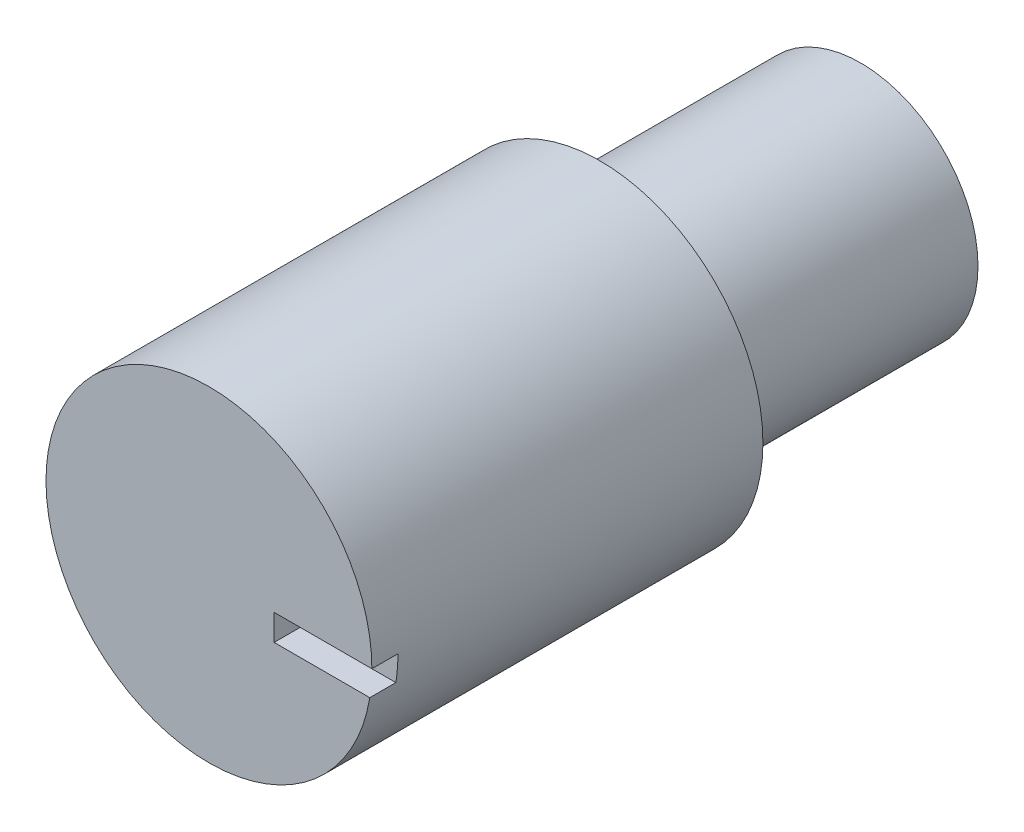
ISO-10303-21;
HEADER;
FILE_DESCRIPTION(('STEP AP214'),'2;1');
FILE_NAME('part.step','',(''),(''),'','','');
FILE_SCHEMA(('AUTOMOTIVE_DESIGN { 1 0 10303 214 1 1 1 1 }'));
ENDSEC;
DATA;
#1=APPLICATION_CONTEXT('core data for automotive mechanical design processes');
#2=APPLICATION_PROTOCOL_DEFINITION('international standard','automotive_design',2000,#1);
#3=PRODUCT_CONTEXT('',#1,'mechanical');
#4=PRODUCT('Part','Part','',(#3));
#5=PRODUCT_RELATED_PRODUCT_CATEGORY('part','',(#4));
#6=PRODUCT_DEFINITION_FORMATION('','',#4);
#7=PRODUCT_DEFINITION_CONTEXT('part definition',#1,'design');
#8=PRODUCT_DEFINITION('design','',#6,#7);
#9=PRODUCT_DEFINITION_SHAPE('','',#8);
#10=(LENGTH_UNIT() NAMED_UNIT(*) SI_UNIT(.MILLI.,.METRE.));
#11=(NAMED_UNIT(*) PLANE_ANGLE_UNIT() SI_UNIT($,.RADIAN.));
#12=(NAMED_UNIT(*) SI_UNIT($,.STERADIAN.) SOLID_ANGLE_UNIT());
#13=UNCERTAINTY_MEASURE_WITH_UNIT(LENGTH_MEASURE(1.E-05),#10,'distance_accuracy_value','');
#14=(GEOMETRIC_REPRESENTATION_CONTEXT(3) GLOBAL_UNCERTAINTY_ASSIGNED_CONTEXT((#13)) GLOBAL_UNIT_ASSIGNED_CONTEXT((#10,
#11,#12)) REPRESENTATION_CONTEXT('',''));
#15=CARTESIAN_POINT('',(0.,0.,0.));
#16=DIRECTION('',(0.,0.,1.));
#17=DIRECTION('',(1.,0.,0.));
#18=AXIS2_PLACEMENT_3D('',#15,#16,#17);
#19=CARTESIAN_POINT('',(0.,0.,-60.));
#20=DIRECTION('',(0.,0.,1.));
#21=DIRECTION('',(1.,0.,0.));
#22=AXIS2_PLACEMENT_3D('',#19,#20,#21);
#23=CYLINDRICAL_SURFACE('',#22,25.);
#24=DIRECTION('',(0.,0.,1.));
#25=VECTOR('',#24,1.);
#26=CARTESIAN_POINT('',(24.6779253585061,-4.,-60.));
#27=LINE('',#26,#25);
#28=CARTESIAN_POINT('',(24.6779253585061,-4.,0.));
#29=VERTEX_POINT('',#28);
#30=CARTESIAN_POINT('',(24.6779253585061,-4.,-4.));
#31=VERTEX_POINT('',#30);
#32=EDGE_CURVE('E83',#29,#31,#27,.F.);
#33=ORIENTED_EDGE('',*,*,#32,.F.);
#34=CARTESIAN_POINT('',(0.,0.,0.));
#35=DIRECTION('',(0.,0.,1.));
#36=DIRECTION('',(1.,0.,0.));
#37=AXIS2_PLACEMENT_3D('',#34,#35,#36);
#38=CIRCLE('',#37,25.);
#39=CARTESIAN_POINT('',(25.,0.,0.));
#40=VERTEX_POINT('',#39);
#41=EDGE_CURVE('E115',#40,#29,#38,.T.);
#42=ORIENTED_EDGE('',*,*,#41,.F.);
#43=DIRECTION('',(0.,0.,1.));
#44=VECTOR('',#43,1.);
#45=CARTESIAN_POINT('',(25.,0.,-60.));
#46=LINE('',#45,#44);
#47=CARTESIAN_POINT('',(25.,0.,-4.));
#48=VERTEX_POINT('',#47);
#49=EDGE_CURVE('E54',#40,#48,#46,.F.);
#50=ORIENTED_EDGE('',*,*,#49,.T.);
#51=CARTESIAN_POINT('',(0.,0.,-4.));
#52=DIRECTION('',(0.,0.,-1.));
#53=DIRECTION('',(-1.,0.,0.));
#54=AXIS2_PLACEMENT_3D('',#51,#52,#53);
#55=CIRCLE('',#54,25.);
#56=EDGE_CURVE('E11',#31,#48,#55,.F.);
#57=ORIENTED_EDGE('',*,*,#56,.F.);
#58=EDGE_LOOP('',(#33,#42,#50,#57));
#59=FACE_BOUND('',#58,.T.);
#60=CARTESIAN_POINT('',(0.,0.,-60.));
#61=DIRECTION('',(0.,0.,1.));
#62=DIRECTION('',(1.,0.,0.));
#63=AXIS2_PLACEMENT_3D('',#60,#61,#62);
#64=CIRCLE('',#63,25.);
#65=CARTESIAN_POINT('',(25.,0.,-60.));
#66=VERTEX_POINT('',#65);
#67=EDGE_CURVE('E114',#66,#66,#64,.T.);
#68=ORIENTED_EDGE('',*,*,#67,.T.);
#69=EDGE_LOOP('',(#68));
#70=FACE_BOUND('',#69,.T.);
#71=ADVANCED_FACE('F41',(#59,#70),#23,.T.);
#72=CARTESIAN_POINT('',(0.,0.,-60.));
#73=DIRECTION('',(0.,0.,1.));
#74=DIRECTION('',(1.,0.,0.));
#75=AXIS2_PLACEMENT_3D('',#72,#73,#74);
#76=PLANE('',#75);
#77=CARTESIAN_POINT('',(0.,0.,-60.));
#78=DIRECTION('',(0.,0.,1.));
#79=DIRECTION('',(1.,0.,0.));
#80=AXIS2_PLACEMENT_3D('',#77,#78,#79);
#81=CIRCLE('',#80,18.);
#82=CARTESIAN_POINT('',(18.,0.,-60.));
#83=VERTEX_POINT('',#82);
#84=EDGE_CURVE('E108',#83,#83,#81,.T.);
#85=ORIENTED_EDGE('',*,*,#84,.T.);
#86=EDGE_LOOP('',(#85));
#87=FACE_BOUND('',#86,.T.);
#88=ORIENTED_EDGE('',*,*,#67,.F.);
#89=EDGE_LOOP('',(#88));
#90=FACE_BOUND('',#89,.T.);
#91=ADVANCED_FACE('F135',(#87,#90),#76,.F.);
#92=CARTESIAN_POINT('',(0.,0.,0.));
#93=DIRECTION('',(0.,0.,1.));
#94=DIRECTION('',(1.,0.,0.));
#95=AXIS2_PLACEMENT_3D('',#92,#93,#94);
#96=PLANE('',#95);
#97=DIRECTION('',(1.,0.,0.));
#98=VECTOR('',#97,1.);
#99=CARTESIAN_POINT('',(0.,-4.,0.));
#100=LINE('',#99,#98);
#101=CARTESIAN_POINT('',(10.,-4.,0.));
#102=VERTEX_POINT('',#101);
#103=EDGE_CURVE('E48',#102,#29,#100,.T.);
#104=ORIENTED_EDGE('',*,*,#103,.F.);
#105=DIRECTION('',(0.,-1.,0.));
#106=VECTOR('',#105,1.);
#107=CARTESIAN_POINT('',(10.,0.,0.));
#108=LINE('',#107,#106);
#109=CARTESIAN_POINT('',(10.,0.,0.));
#110=VERTEX_POINT('',#109);
#111=EDGE_CURVE('E98',#110,#102,#108,.T.);
#112=ORIENTED_EDGE('',*,*,#111,.F.);
#113=DIRECTION('',(1.,0.,0.));
#114=VECTOR('',#113,1.);
#115=CARTESIAN_POINT('',(0.,0.,0.));
#116=LINE('',#115,#114);
#117=EDGE_CURVE('E118',#110,#40,#116,.T.);
#118=ORIENTED_EDGE('',*,*,#117,.T.);
#119=ORIENTED_EDGE('',*,*,#41,.T.);
#120=EDGE_LOOP('',(#104,#112,#118,#119));
#121=FACE_BOUND('',#120,.T.);
#122=ADVANCED_FACE('F125',(#121),#96,.T.);
#123=CARTESIAN_POINT('',(0.,0.,-100.));
#124=DIRECTION('',(0.,0.,1.));
#125=DIRECTION('',(1.,0.,0.));
#126=AXIS2_PLACEMENT_3D('',#123,#124,#125);
#127=CYLINDRICAL_SURFACE('',#126,18.);
#128=CARTESIAN_POINT('',(0.,0.,-100.));
#129=DIRECTION('',(0.,0.,1.));
#130=DIRECTION('',(1.,0.,0.));
#131=AXIS2_PLACEMENT_3D('',#128,#129,#130);
#132=CIRCLE('',#131,18.);
#133=CARTESIAN_POINT('',(18.,0.,-100.));
#134=VERTEX_POINT('',#133);
#135=EDGE_CURVE('E106',#134,#134,#132,.T.);
#136=ORIENTED_EDGE('',*,*,#135,.T.);
#137=EDGE_LOOP('',(#136));
#138=FACE_BOUND('',#137,.T.);
#139=ORIENTED_EDGE('',*,*,#84,.F.);
#140=EDGE_LOOP('',(#139));
#141=FACE_BOUND('',#140,.T.);
#142=ADVANCED_FACE('F144',(#138,#141),#127,.T.);
#143=CARTESIAN_POINT('',(0.,0.,-100.));
#144=DIRECTION('',(0.,0.,1.));
#145=DIRECTION('',(1.,0.,0.));
#146=AXIS2_PLACEMENT_3D('',#143,#144,#145);
#147=PLANE('',#146);
#148=ORIENTED_EDGE('',*,*,#135,.F.);
#149=EDGE_LOOP('',(#148));
#150=FACE_BOUND('',#149,.T.);
#151=ADVANCED_FACE('F149',(#150),#147,.F.);
#152=CARTESIAN_POINT('',(10.,-4.,4.));
#153=DIRECTION('',(-1.,0.,0.));
#154=DIRECTION('',(0.,0.,1.));
#155=AXIS2_PLACEMENT_3D('',#152,#153,#154);
#156=PLANE('',#155);
#157=ORIENTED_EDGE('',*,*,#111,.T.);
#158=DIRECTION('',(0.,0.,1.));
#159=VECTOR('',#158,1.);
#160=CARTESIAN_POINT('',(10.,-4.,4.));
#161=LINE('',#160,#159);
#162=CARTESIAN_POINT('',(10.,-4.,-4.));
#163=VERTEX_POINT('',#162);
#164=EDGE_CURVE('E82',#163,#102,#161,.T.);
#165=ORIENTED_EDGE('',*,*,#164,.F.);
#166=DIRECTION('',(0.,1.,0.));
#167=VECTOR('',#166,1.);
#168=CARTESIAN_POINT('',(10.,-4.,-4.));
#169=LINE('',#168,#167);
#170=CARTESIAN_POINT('',(10.,0.,-4.));
#171=VERTEX_POINT('',#170);
#172=EDGE_CURVE('E87',#163,#171,#169,.T.);
#173=ORIENTED_EDGE('',*,*,#172,.T.);
#174=DIRECTION('',(0.,0.,1.));
#175=VECTOR('',#174,1.);
#176=CARTESIAN_POINT('',(10.,0.,4.));
#177=LINE('',#176,#175);
#178=EDGE_CURVE('E99',#171,#110,#177,.T.);
#179=ORIENTED_EDGE('',*,*,#178,.T.);
#180=EDGE_LOOP('',(#157,#165,#173,#179));
#181=FACE_BOUND('',#180,.T.);
#182=ADVANCED_FACE('F96',(#181),#156,.F.);
#183=CARTESIAN_POINT('',(10.,-4.,-4.));
#184=DIRECTION('',(0.,0.,-1.));
#185=DIRECTION('',(-1.,0.,0.));
#186=AXIS2_PLACEMENT_3D('',#183,#184,#185);
#187=PLANE('',#186);
#188=ORIENTED_EDGE('',*,*,#56,.T.);
#189=DIRECTION('',(-1.,0.,0.));
#190=VECTOR('',#189,1.);
#191=CARTESIAN_POINT('',(10.,0.,-4.));
#192=LINE('',#191,#190);
#193=EDGE_CURVE('E93',#48,#171,#192,.T.);
#194=ORIENTED_EDGE('',*,*,#193,.T.);
#195=ORIENTED_EDGE('',*,*,#172,.F.);
#196=DIRECTION('',(-1.,0.,0.));
#197=VECTOR('',#196,1.);
#198=CARTESIAN_POINT('',(10.,-4.,-4.));
#199=LINE('',#198,#197);
#200=EDGE_CURVE('E80',#31,#163,#199,.T.);
#201=ORIENTED_EDGE('',*,*,#200,.F.);
#202=EDGE_LOOP('',(#188,#194,#195,#201));
#203=FACE_BOUND('',#202,.T.);
#204=ADVANCED_FACE('F89',(#203),#187,.F.);
#205=CARTESIAN_POINT('',(0.,-4.,0.));
#206=DIRECTION('',(0.,-1.,0.));
#207=DIRECTION('',(0.,0.,-1.));
#208=AXIS2_PLACEMENT_3D('',#205,#206,#207);
#209=PLANE('',#208);
#210=ORIENTED_EDGE('',*,*,#32,.T.);
#211=ORIENTED_EDGE('',*,*,#200,.T.);
#212=ORIENTED_EDGE('',*,*,#164,.T.);
#213=ORIENTED_EDGE('',*,*,#103,.T.);
#214=EDGE_LOOP('',(#210,#211,#212,#213));
#215=FACE_BOUND('',#214,.T.);
#216=ADVANCED_FACE('F81',(#215),#209,.F.);
#217=CARTESIAN_POINT('',(0.,0.,0.));
#218=DIRECTION('',(0.,-1.,0.));
#219=DIRECTION('',(0.,0.,-1.));
#220=AXIS2_PLACEMENT_3D('',#217,#218,#219);
#221=PLANE('',#220);
#222=ORIENTED_EDGE('',*,*,#117,.F.);
#223=ORIENTED_EDGE('',*,*,#178,.F.);
#224=ORIENTED_EDGE('',*,*,#193,.F.);
#225=ORIENTED_EDGE('',*,*,#49,.F.);
#226=EDGE_LOOP('',(#222,#223,#224,#225));
#227=FACE_BOUND('',#226,.T.);
#228=ADVANCED_FACE('F124',(#227),#221,.T.);
#229=CLOSED_SHELL('',(#71,#91,#122,#142,#151,#182,#204,#216,#228));
#230=MANIFOLD_SOLID_BREP('B2',#229);
#231=ADVANCED_BREP_SHAPE_REPRESENTATION('',(#18,#230),#14);
#232=SHAPE_DEFINITION_REPRESENTATION(#9,#231);
ENDSEC;
END-ISO-10303-21;
